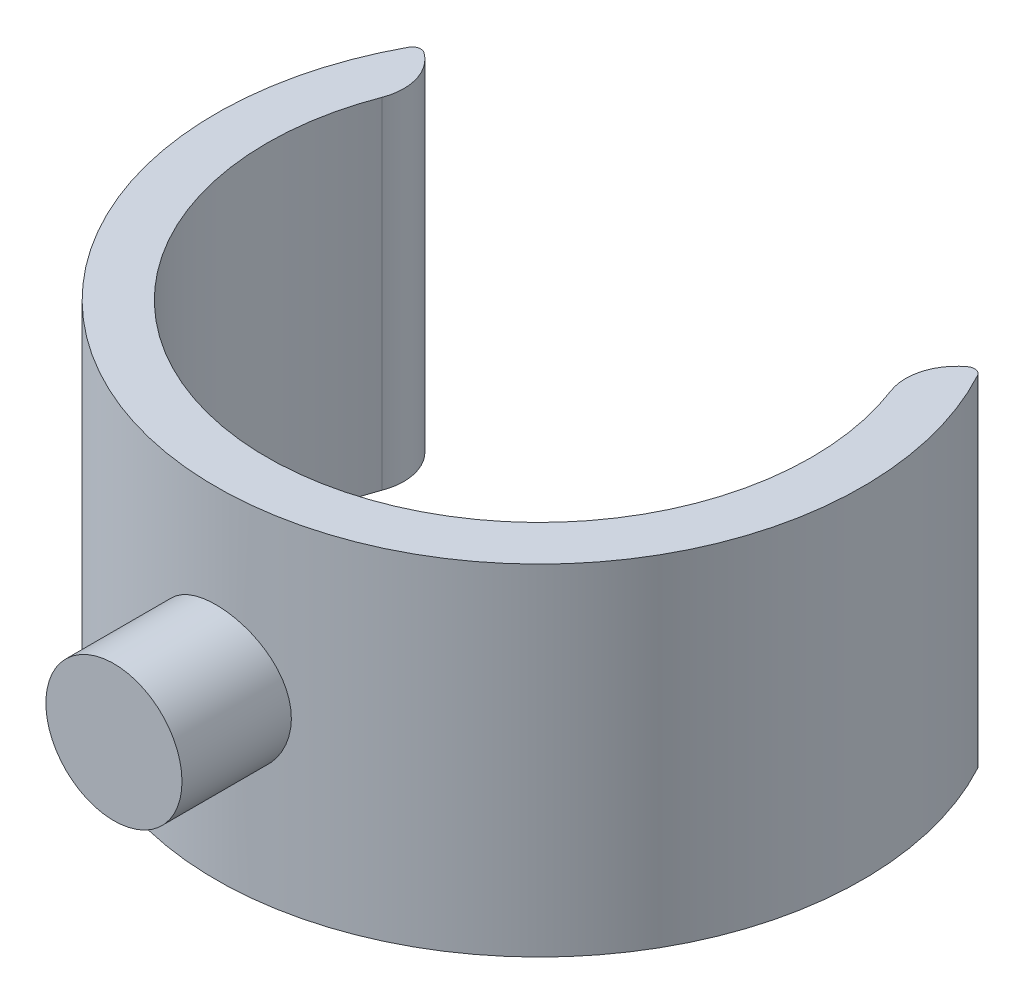
ISO-10303-21;
HEADER;
FILE_DESCRIPTION(('STEP AP214'),'2;1');
FILE_NAME('part.step','',(''),(''),'','','');
FILE_SCHEMA(('AUTOMOTIVE_DESIGN { 1 0 10303 214 1 1 1 1 }'));
ENDSEC;
DATA;
#1=APPLICATION_CONTEXT('core data for automotive mechanical design processes');
#2=APPLICATION_PROTOCOL_DEFINITION('international standard','automotive_design',2000,#1);
#3=PRODUCT_CONTEXT('',#1,'mechanical');
#4=PRODUCT('Part','Part','',(#3));
#5=PRODUCT_RELATED_PRODUCT_CATEGORY('part','',(#4));
#6=PRODUCT_DEFINITION_FORMATION('','',#4);
#7=PRODUCT_DEFINITION_CONTEXT('part definition',#1,'design');
#8=PRODUCT_DEFINITION('design','',#6,#7);
#9=PRODUCT_DEFINITION_SHAPE('','',#8);
#10=(LENGTH_UNIT() NAMED_UNIT(*) SI_UNIT(.MILLI.,.METRE.));
#11=(NAMED_UNIT(*) PLANE_ANGLE_UNIT() SI_UNIT($,.RADIAN.));
#12=(NAMED_UNIT(*) SI_UNIT($,.STERADIAN.) SOLID_ANGLE_UNIT());
#13=UNCERTAINTY_MEASURE_WITH_UNIT(LENGTH_MEASURE(1.E-05),#10,'distance_accuracy_value','');
#14=(GEOMETRIC_REPRESENTATION_CONTEXT(3) GLOBAL_UNCERTAINTY_ASSIGNED_CONTEXT((#13)) GLOBAL_UNIT_ASSIGNED_CONTEXT((#10,
#11,#12)) REPRESENTATION_CONTEXT('',''));
#15=CARTESIAN_POINT('',(0.,0.,0.));
#16=DIRECTION('',(0.,0.,1.));
#17=DIRECTION('',(1.,0.,0.));
#18=AXIS2_PLACEMENT_3D('',#15,#16,#17);
#19=CARTESIAN_POINT('',(0.,20.,0.));
#20=DIRECTION('',(0.,-1.,0.));
#21=DIRECTION('',(0.,0.,-1.));
#22=AXIS2_PLACEMENT_3D('',#19,#20,#21);
#23=CYLINDRICAL_SURFACE('',#22,16.);
#24=CARTESIAN_POINT('',(0.,0.,0.));
#25=DIRECTION('',(0.,1.,0.));
#26=DIRECTION('',(0.,0.,1.));
#27=AXIS2_PLACEMENT_3D('',#24,#25,#26);
#28=CIRCLE('',#27,16.);
#29=CARTESIAN_POINT('',(-14.9457488920185,0.,-5.71179394382611));
#30=VERTEX_POINT('',#29);
#31=CARTESIAN_POINT('',(14.9457488920185,0.,-5.71179394382611));
#32=VERTEX_POINT('',#31);
#33=EDGE_CURVE('E94',#30,#32,#28,.T.);
#34=ORIENTED_EDGE('',*,*,#33,.F.);
#35=DIRECTION('',(0.,-1.,0.));
#36=VECTOR('',#35,1.);
#37=CARTESIAN_POINT('',(-14.9457488920185,20.,-5.71179394382611));
#38=LINE('',#37,#36);
#39=CARTESIAN_POINT('',(-14.9457488920185,20.,-5.71179394382611));
#40=VERTEX_POINT('',#39);
#41=EDGE_CURVE('E104',#30,#40,#38,.F.);
#42=ORIENTED_EDGE('',*,*,#41,.T.);
#43=CARTESIAN_POINT('',(0.,20.,0.));
#44=DIRECTION('',(0.,1.,0.));
#45=DIRECTION('',(0.,0.,1.));
#46=AXIS2_PLACEMENT_3D('',#43,#44,#45);
#47=CIRCLE('',#46,16.);
#48=CARTESIAN_POINT('',(14.9457488920185,20.,-5.71179394382611));
#49=VERTEX_POINT('',#48);
#50=EDGE_CURVE('E141',#40,#49,#47,.T.);
#51=ORIENTED_EDGE('',*,*,#50,.T.);
#52=DIRECTION('',(0.,-1.,0.));
#53=VECTOR('',#52,1.);
#54=CARTESIAN_POINT('',(14.9457488920185,20.,-5.71179394382611));
#55=LINE('',#54,#53);
#56=EDGE_CURVE('E98',#49,#32,#55,.T.);
#57=ORIENTED_EDGE('',*,*,#56,.T.);
#58=EDGE_LOOP('',(#34,#42,#51,#57));
#59=FACE_BOUND('',#58,.T.);
#60=ADVANCED_FACE('F36',(#59),#23,.F.);
#61=CARTESIAN_POINT('',(0.,20.,0.));
#62=DIRECTION('',(0.,-1.,0.));
#63=DIRECTION('',(0.,0.,-1.));
#64=AXIS2_PLACEMENT_3D('',#61,#62,#63);
#65=CYLINDRICAL_SURFACE('',#64,19.);
#66=CARTESIAN_POINT('',(4.,10.,18.5741756210067));
#67=CARTESIAN_POINT('',(3.99999209697573,10.2219939099355,18.5741800925644));
#68=CARTESIAN_POINT('',(3.98145669805648,10.4440848103675,18.5781987581776));
#69=CARTESIAN_POINT('',(3.90787726819733,10.88196558886,18.5938123454623));
#70=CARTESIAN_POINT('',(3.85280558197002,11.097750564524,18.6054130060484));
#71=CARTESIAN_POINT('',(3.70795218010443,11.5166216605878,18.6348198362111));
#72=CARTESIAN_POINT('',(3.61820694853935,11.7197208690855,18.6526194811802));
#73=CARTESIAN_POINT('',(3.40665644710499,12.1079800428902,18.6924109014985));
#74=CARTESIAN_POINT('',(3.2848523407299,12.2931406588985,18.7144025247026));
#75=CARTESIAN_POINT('',(3.01060878355596,12.6431716040878,18.7604846869535));
#76=CARTESIAN_POINT('',(2.85776280531542,12.8077201674538,18.7846003824728));
#77=CARTESIAN_POINT('',(2.52665218418007,13.1090420570729,18.8319927013424));
#78=CARTESIAN_POINT('',(2.34838565594524,13.2458133213699,18.855269262297));
#79=CARTESIAN_POINT('',(1.96934875278441,13.488960179083,18.8986334744592));
#80=CARTESIAN_POINT('',(1.76837679312671,13.5950279433122,18.9186879896708));
#81=CARTESIAN_POINT('',(1.35096959133897,13.7717677058603,18.9530650481467));
#82=CARTESIAN_POINT('',(1.13453595749703,13.8424433794758,18.9673881865556));
#83=CARTESIAN_POINT('',(0.695692072017949,13.9453853478473,18.9885109106967));
#84=CARTESIAN_POINT('',(0.473414649652124,13.9781956847406,18.9954169607882));
#85=CARTESIAN_POINT('',(0.0264102247709491,14.0061749915995,19.0012957272881));
#86=CARTESIAN_POINT('',(-0.198316514772728,14.0013479635212,19.000269287153));
#87=CARTESIAN_POINT('',(-0.640095358107473,13.9545980929001,18.9904805979704));
#88=CARTESIAN_POINT('',(-0.857212603423214,13.9132614812265,18.9818406040351));
#89=CARTESIAN_POINT('',(-1.28135804365579,13.7955980704895,18.957934245003));
#90=CARTESIAN_POINT('',(-1.48838580469215,13.7192697681366,18.9426675952178));
#91=CARTESIAN_POINT('',(-1.88812304501249,13.5332601586271,18.9070244834718));
#92=CARTESIAN_POINT('',(-2.08072437910151,13.4233533046122,18.8866136354899));
#93=CARTESIAN_POINT('',(-2.44496551663546,13.1734740366913,18.8429256009233));
#94=CARTESIAN_POINT('',(-2.6166026576966,13.0334978102878,18.8196480510291));
#95=CARTESIAN_POINT('',(-2.93752659395386,12.7242505470185,18.7722614464982));
#96=CARTESIAN_POINT('',(-3.08631828354998,12.5544664160668,18.7481450140379));
#97=CARTESIAN_POINT('',(-3.35340413602387,12.1921086817106,18.702221809083));
#98=CARTESIAN_POINT('',(-3.47169759033983,11.9995345489804,18.6804150902565));
#99=CARTESIAN_POINT('',(-3.67462679534691,11.5963030533554,18.6415629939477));
#100=CARTESIAN_POINT('',(-3.75917501777732,11.3856003654661,18.6245300322231));
#101=CARTESIAN_POINT('',(-3.89151893572158,10.9525360794226,18.5973302402537));
#102=CARTESIAN_POINT('',(-3.93931999022486,10.7301761863404,18.5871624088652));
#103=CARTESIAN_POINT('',(-3.99605731290016,10.2846170428132,18.5750467156581));
#104=CARTESIAN_POINT('',(-4.00571182705191,10.0615132792185,18.5729469642734));
#105=CARTESIAN_POINT('',(-3.98782128202763,9.61688380603986,18.5767963515876));
#106=CARTESIAN_POINT('',(-3.96027857660374,9.39535799749834,18.5827449810041));
#107=CARTESIAN_POINT('',(-3.86939685006085,8.96263462230042,18.6018779669256));
#108=CARTESIAN_POINT('',(-3.80644810668871,8.7513512786145,18.6149833896401));
#109=CARTESIAN_POINT('',(-3.64696138962148,8.34233028006887,18.6468830012735));
#110=CARTESIAN_POINT('',(-3.55042039845859,8.14459384398838,18.6656777012193));
#111=CARTESIAN_POINT('',(-3.32488779645435,7.76515590190071,18.7071752603848));
#112=CARTESIAN_POINT('',(-3.19545060588171,7.58372506434026,18.7299303079771));
#113=CARTESIAN_POINT('',(-2.9083877552009,7.24489627381333,18.7766445458784));
#114=CARTESIAN_POINT('',(-2.75075886434576,7.08750107914936,18.8006038739704));
#115=CARTESIAN_POINT('',(-2.40854844733165,6.79845261378171,18.8475242959355));
#116=CARTESIAN_POINT('',(-2.22355096769268,6.66728722326386,18.8704612165259));
#117=CARTESIAN_POINT('',(-1.83372970379521,6.43789780071781,18.9123189031461));
#118=CARTESIAN_POINT('',(-1.62890680703577,6.33967229499001,18.9312398488328));
#119=CARTESIAN_POINT('',(-1.20647369903032,6.17964462077827,18.962831185982));
#120=CARTESIAN_POINT('',(-0.98894997632055,6.11762193469646,18.9755393418841));
#121=CARTESIAN_POINT('',(-0.546274987879081,6.03106707201175,18.9934359448604));
#122=CARTESIAN_POINT('',(-0.321124749414208,6.00652986660118,18.9986254005895));
#123=CARTESIAN_POINT('',(0.125767950618484,5.99585459507705,19.0008726743602));
#124=CARTESIAN_POINT('',(0.347492499757564,6.00898586960137,18.9980852238023));
#125=CARTESIAN_POINT('',(0.785499300111815,6.07164991466239,18.9850206205469));
#126=CARTESIAN_POINT('',(1.00178163545286,6.12118212215462,18.9747435836975));
#127=CARTESIAN_POINT('',(1.42224847742844,6.25490298215312,18.9478628420671));
#128=CARTESIAN_POINT('',(1.62646489653558,6.338995060737,18.9312767767412));
#129=CARTESIAN_POINT('',(2.01799027216437,6.53935158309247,18.893555629305));
#130=CARTESIAN_POINT('',(2.20529771878918,6.65561889620965,18.8724201415205));
#131=CARTESIAN_POINT('',(2.56127441274682,6.91944489844856,18.8274446003709));
#132=CARTESIAN_POINT('',(2.72955466615975,7.06752146710237,18.8035632655154));
#133=CARTESIAN_POINT('',(3.03912864960601,7.38970911635682,18.7560199700871));
#134=CARTESIAN_POINT('',(3.18041592221213,7.56382640886338,18.7323580632921));
#135=CARTESIAN_POINT('',(3.43364188830775,7.93570174539012,18.6876131134287));
#136=CARTESIAN_POINT('',(3.5452020550443,8.13372196265025,18.6665650009163));
#137=CARTESIAN_POINT('',(3.73328528235461,8.54609397527376,18.6298640767119));
#138=CARTESIAN_POINT('',(3.80983895871822,8.76043130796149,18.6142065535206));
#139=CARTESIAN_POINT('',(3.91153764871148,9.14592540036052,18.5930586025571));
#140=CARTESIAN_POINT('',(3.94464935218758,9.31494087732234,18.5860230677516));
#141=CARTESIAN_POINT('',(3.98888312946577,9.65595156621164,18.5765799411743));
#142=CARTESIAN_POINT('',(4.00000612513099,9.82794665291582,18.574172155387));
#143=CARTESIAN_POINT('',(4.,10.,18.5741756210067));
#144=B_SPLINE_CURVE_WITH_KNOTS('',3,(#66,#67,#68,#69,#70,#71,#72,#73,#74,#75,#76,#77,#78,#79,
#80,#81,#82,#83,#84,#85,#86,#87,#88,#89,#90,#91,#92,#93,#94,#95,#96,#97,#98,#99,#100,#101,#102,
#103,#104,#105,#106,#107,#108,#109,#110,#111,#112,#113,#114,#115,#116,#117,#118,#119,#120,#121,
#122,#123,#124,#125,#126,#127,#128,#129,#130,#131,#132,#133,#134,#135,#136,#137,#138,#139,#140,
#141,#142,#143),.UNSPECIFIED.,.T.,.F.,(4,2,2,2,2,2,2,2,2,2,2,2,2,2,2,2,2,2,2,2,2,2,2,2,2,2,2,2,
2,2,2,2,2,2,2,2,2,2,4),(0.,0.665351440068111,1.3312070778075,1.99636399109128,2.66149676754794,
3.33597821072585,4.01050970352424,4.69158664936208,5.37259285399292,6.04368764782412,
6.7147110855618,7.37515195355072,8.03562119761875,8.70062815519556,9.36571947885956,
10.0436427222326,10.7215817142952,11.4012678892752,12.0808549240337,12.7475835229916,
13.4142699349163,14.0737476156907,14.7332845502134,15.4022812466561,16.0713546587832,
16.7519051017766,17.4324250935175,18.1087554578689,18.7849950821784,19.4482068293803,
20.1114083183328,20.772769027137,21.4341887342463,22.1073264640987,22.7806250250196,
23.4621264311976,24.1430306681883,24.6587238325688,25.1743953763704),.UNSPECIFIED.);
#145=CARTESIAN_POINT('',(4.,10.,18.5741756210067));
#146=VERTEX_POINT('',#145);
#147=EDGE_CURVE('E108',#146,#146,#144,.T.);
#148=ORIENTED_EDGE('',*,*,#147,.F.);
#149=EDGE_LOOP('',(#148));
#150=FACE_BOUND('',#149,.T.);
#151=CARTESIAN_POINT('',(0.,0.,0.));
#152=DIRECTION('',(0.,1.,0.));
#153=DIRECTION('',(0.,0.,1.));
#154=AXIS2_PLACEMENT_3D('',#151,#152,#153);
#155=CIRCLE('',#154,19.);
#156=CARTESIAN_POINT('',(-16.7123182697726,0.,-9.03871772154788));
#157=VERTEX_POINT('',#156);
#158=CARTESIAN_POINT('',(16.7123182697726,0.,-9.03871772154787));
#159=VERTEX_POINT('',#158);
#160=EDGE_CURVE('E107',#157,#159,#155,.T.);
#161=ORIENTED_EDGE('',*,*,#160,.T.);
#162=DIRECTION('',(0.,-1.,0.));
#163=VECTOR('',#162,1.);
#164=CARTESIAN_POINT('',(16.7123182697726,20.,-9.03871772154787));
#165=LINE('',#164,#163);
#166=CARTESIAN_POINT('',(16.7123182697726,20.,-9.03871772154787));
#167=VERTEX_POINT('',#166);
#168=EDGE_CURVE('E57',#159,#167,#165,.F.);
#169=ORIENTED_EDGE('',*,*,#168,.T.);
#170=CARTESIAN_POINT('',(0.,20.,0.));
#171=DIRECTION('',(0.,1.,0.));
#172=DIRECTION('',(0.,0.,1.));
#173=AXIS2_PLACEMENT_3D('',#170,#171,#172);
#174=CIRCLE('',#173,19.);
#175=CARTESIAN_POINT('',(-16.7123182697726,20.,-9.03871772154788));
#176=VERTEX_POINT('',#175);
#177=EDGE_CURVE('E133',#176,#167,#174,.T.);
#178=ORIENTED_EDGE('',*,*,#177,.F.);
#179=DIRECTION('',(0.,-1.,0.));
#180=VECTOR('',#179,1.);
#181=CARTESIAN_POINT('',(-16.7123182697726,20.,-9.03871772154788));
#182=LINE('',#181,#180);
#183=EDGE_CURVE('E124',#176,#157,#182,.T.);
#184=ORIENTED_EDGE('',*,*,#183,.T.);
#185=EDGE_LOOP('',(#161,#169,#178,#184));
#186=FACE_BOUND('',#185,.T.);
#187=ADVANCED_FACE('F139',(#150,#186),#65,.T.);
#188=CARTESIAN_POINT('',(-37.0877506732344,20.,4.75000000000002));
#189=DIRECTION('',(0.,1.,0.));
#190=DIRECTION('',(0.,0.,1.));
#191=AXIS2_PLACEMENT_3D('',#188,#189,#190);
#192=PLANE('',#191);
#193=ORIENTED_EDGE('',*,*,#177,.T.);
#194=CARTESIAN_POINT('',(16.2725204205681,20.,-8.80085672887556));
#195=DIRECTION('',(0.,1.,0.));
#196=DIRECTION('',(0.,0.,1.));
#197=AXIS2_PLACEMENT_3D('',#194,#195,#196);
#198=CIRCLE('',#197,0.5);
#199=CARTESIAN_POINT('',(15.9774091428273,20.,-9.20447701299197));
#200=VERTEX_POINT('',#199);
#201=EDGE_CURVE('E44',#167,#200,#198,.T.);
#202=ORIENTED_EDGE('',*,*,#201,.T.);
#203=CARTESIAN_POINT('',(17.7480768092719,20.,-6.78275530829351));
#204=DIRECTION('',(0.,1.,0.));
#205=DIRECTION('',(0.,0.,1.));
#206=AXIS2_PLACEMENT_3D('',#203,#204,#205);
#207=CIRCLE('',#206,3.);
#208=EDGE_CURVE('E112',#200,#49,#207,.T.);
#209=ORIENTED_EDGE('',*,*,#208,.T.);
#210=ORIENTED_EDGE('',*,*,#50,.F.);
#211=CARTESIAN_POINT('',(-17.7480768092719,20.,-6.78275530829351));
#212=DIRECTION('',(0.,1.,0.));
#213=DIRECTION('',(0.,0.,1.));
#214=AXIS2_PLACEMENT_3D('',#211,#212,#213);
#215=CIRCLE('',#214,3.);
#216=CARTESIAN_POINT('',(-15.9774091428273,20.,-9.20447701299197));
#217=VERTEX_POINT('',#216);
#218=EDGE_CURVE('E111',#40,#217,#215,.T.);
#219=ORIENTED_EDGE('',*,*,#218,.T.);
#220=CARTESIAN_POINT('',(-16.2725204205681,20.,-8.80085672887557));
#221=DIRECTION('',(0.,1.,0.));
#222=DIRECTION('',(0.,0.,1.));
#223=AXIS2_PLACEMENT_3D('',#220,#221,#222);
#224=CIRCLE('',#223,0.5);
#225=EDGE_CURVE('E128',#217,#176,#224,.T.);
#226=ORIENTED_EDGE('',*,*,#225,.T.);
#227=EDGE_LOOP('',(#193,#202,#209,#210,#219,#226));
#228=FACE_BOUND('',#227,.T.);
#229=ADVANCED_FACE('F132',(#228),#192,.T.);
#230=CARTESIAN_POINT('',(-37.0877506732344,0.,4.75000000000002));
#231=DIRECTION('',(0.,1.,0.));
#232=DIRECTION('',(0.,0.,1.));
#233=AXIS2_PLACEMENT_3D('',#230,#231,#232);
#234=PLANE('',#233);
#235=CARTESIAN_POINT('',(17.7480768092719,0.,-6.78275530829351));
#236=DIRECTION('',(0.,1.,0.));
#237=DIRECTION('',(0.,0.,1.));
#238=AXIS2_PLACEMENT_3D('',#235,#236,#237);
#239=CIRCLE('',#238,3.);
#240=CARTESIAN_POINT('',(15.9774091428273,0.,-9.20447701299197));
#241=VERTEX_POINT('',#240);
#242=EDGE_CURVE('E99',#32,#241,#239,.F.);
#243=ORIENTED_EDGE('',*,*,#242,.T.);
#244=CARTESIAN_POINT('',(16.2725204205681,0.,-8.80085672887556));
#245=DIRECTION('',(0.,1.,0.));
#246=DIRECTION('',(0.,0.,1.));
#247=AXIS2_PLACEMENT_3D('',#244,#245,#246);
#248=CIRCLE('',#247,0.5);
#249=EDGE_CURVE('E122',#241,#159,#248,.F.);
#250=ORIENTED_EDGE('',*,*,#249,.T.);
#251=ORIENTED_EDGE('',*,*,#160,.F.);
#252=CARTESIAN_POINT('',(-16.2725204205681,0.,-8.80085672887557));
#253=DIRECTION('',(0.,1.,0.));
#254=DIRECTION('',(0.,0.,1.));
#255=AXIS2_PLACEMENT_3D('',#252,#253,#254);
#256=CIRCLE('',#255,0.5);
#257=CARTESIAN_POINT('',(-15.9774091428273,0.,-9.20447701299197));
#258=VERTEX_POINT('',#257);
#259=EDGE_CURVE('E96',#157,#258,#256,.F.);
#260=ORIENTED_EDGE('',*,*,#259,.T.);
#261=CARTESIAN_POINT('',(-17.7480768092719,0.,-6.78275530829351));
#262=DIRECTION('',(0.,1.,0.));
#263=DIRECTION('',(0.,0.,1.));
#264=AXIS2_PLACEMENT_3D('',#261,#262,#263);
#265=CIRCLE('',#264,3.);
#266=EDGE_CURVE('E90',#258,#30,#265,.F.);
#267=ORIENTED_EDGE('',*,*,#266,.T.);
#268=ORIENTED_EDGE('',*,*,#33,.T.);
#269=EDGE_LOOP('',(#243,#250,#251,#260,#267,#268));
#270=FACE_BOUND('',#269,.T.);
#271=ADVANCED_FACE('F93',(#270),#234,.F.);
#272=CARTESIAN_POINT('',(0.,10.,25.));
#273=DIRECTION('',(0.,0.,1.));
#274=DIRECTION('',(1.,0.,0.));
#275=AXIS2_PLACEMENT_3D('',#272,#273,#274);
#276=PLANE('',#275);
#277=CARTESIAN_POINT('',(0.,10.,25.));
#278=DIRECTION('',(0.,0.,1.));
#279=DIRECTION('',(1.,0.,0.));
#280=AXIS2_PLACEMENT_3D('',#277,#278,#279);
#281=CIRCLE('',#280,4.);
#282=CARTESIAN_POINT('',(4.,10.,25.));
#283=VERTEX_POINT('',#282);
#284=EDGE_CURVE('E153',#283,#283,#281,.T.);
#285=ORIENTED_EDGE('',*,*,#284,.T.);
#286=EDGE_LOOP('',(#285));
#287=FACE_BOUND('',#286,.T.);
#288=ADVANCED_FACE('F159',(#287),#276,.T.);
#289=CARTESIAN_POINT('',(0.,10.,-9.50099999999997));
#290=DIRECTION('',(0.,0.,1.));
#291=DIRECTION('',(1.,0.,0.));
#292=AXIS2_PLACEMENT_3D('',#289,#290,#291);
#293=CYLINDRICAL_SURFACE('',#292,4.);
#294=ORIENTED_EDGE('',*,*,#284,.F.);
#295=EDGE_LOOP('',(#294));
#296=FACE_BOUND('',#295,.T.);
#297=ORIENTED_EDGE('',*,*,#147,.T.);
#298=EDGE_LOOP('',(#297));
#299=FACE_BOUND('',#298,.T.);
#300=ADVANCED_FACE('F154',(#296,#299),#293,.T.);
#301=CARTESIAN_POINT('',(-17.7480768092719,20.,-6.78275530829351));
#302=DIRECTION('',(0.,-1.,0.));
#303=DIRECTION('',(0.,0.,-1.));
#304=AXIS2_PLACEMENT_3D('',#301,#302,#303);
#305=CYLINDRICAL_SURFACE('',#304,3.);
#306=ORIENTED_EDGE('',*,*,#266,.F.);
#307=DIRECTION('',(0.,-1.,0.));
#308=VECTOR('',#307,1.);
#309=CARTESIAN_POINT('',(-15.9774091428273,20.,-9.20447701299197));
#310=LINE('',#309,#308);
#311=EDGE_CURVE('E11',#258,#217,#310,.F.);
#312=ORIENTED_EDGE('',*,*,#311,.T.);
#313=ORIENTED_EDGE('',*,*,#218,.F.);
#314=ORIENTED_EDGE('',*,*,#41,.F.);
#315=EDGE_LOOP('',(#306,#312,#313,#314));
#316=FACE_BOUND('',#315,.T.);
#317=ADVANCED_FACE('F110',(#316),#305,.T.);
#318=CARTESIAN_POINT('',(17.7480768092719,20.,-6.78275530829351));
#319=DIRECTION('',(0.,-1.,0.));
#320=DIRECTION('',(0.,0.,-1.));
#321=AXIS2_PLACEMENT_3D('',#318,#319,#320);
#322=CYLINDRICAL_SURFACE('',#321,3.);
#323=ORIENTED_EDGE('',*,*,#208,.F.);
#324=DIRECTION('',(0.,-1.,0.));
#325=VECTOR('',#324,1.);
#326=CARTESIAN_POINT('',(15.9774091428273,20.,-9.20447701299197));
#327=LINE('',#326,#325);
#328=EDGE_CURVE('E118',#200,#241,#327,.T.);
#329=ORIENTED_EDGE('',*,*,#328,.T.);
#330=ORIENTED_EDGE('',*,*,#242,.F.);
#331=ORIENTED_EDGE('',*,*,#56,.F.);
#332=EDGE_LOOP('',(#323,#329,#330,#331));
#333=FACE_BOUND('',#332,.T.);
#334=ADVANCED_FACE('F137',(#333),#322,.T.);
#335=CARTESIAN_POINT('',(16.2725204205681,20.,-8.80085672887556));
#336=DIRECTION('',(0.,-1.,0.));
#337=DIRECTION('',(0.,0.,-1.));
#338=AXIS2_PLACEMENT_3D('',#335,#336,#337);
#339=CYLINDRICAL_SURFACE('',#338,0.5);
#340=ORIENTED_EDGE('',*,*,#201,.F.);
#341=ORIENTED_EDGE('',*,*,#168,.F.);
#342=ORIENTED_EDGE('',*,*,#249,.F.);
#343=ORIENTED_EDGE('',*,*,#328,.F.);
#344=EDGE_LOOP('',(#340,#341,#342,#343));
#345=FACE_BOUND('',#344,.T.);
#346=ADVANCED_FACE('F138',(#345),#339,.T.);
#347=CARTESIAN_POINT('',(-16.2725204205681,20.,-8.80085672887557));
#348=DIRECTION('',(0.,-1.,0.));
#349=DIRECTION('',(0.,0.,-1.));
#350=AXIS2_PLACEMENT_3D('',#347,#348,#349);
#351=CYLINDRICAL_SURFACE('',#350,0.5);
#352=ORIENTED_EDGE('',*,*,#225,.F.);
#353=ORIENTED_EDGE('',*,*,#311,.F.);
#354=ORIENTED_EDGE('',*,*,#259,.F.);
#355=ORIENTED_EDGE('',*,*,#183,.F.);
#356=EDGE_LOOP('',(#352,#353,#354,#355));
#357=FACE_BOUND('',#356,.T.);
#358=ADVANCED_FACE('F38',(#357),#351,.T.);
#359=CLOSED_SHELL('',(#60,#187,#229,#271,#288,#300,#317,#334,#346,#358));
#360=MANIFOLD_SOLID_BREP('B2',#359);
#361=ADVANCED_BREP_SHAPE_REPRESENTATION('',(#18,#360),#14);
#362=SHAPE_DEFINITION_REPRESENTATION(#9,#361);
ENDSEC;
END-ISO-10303-21;
